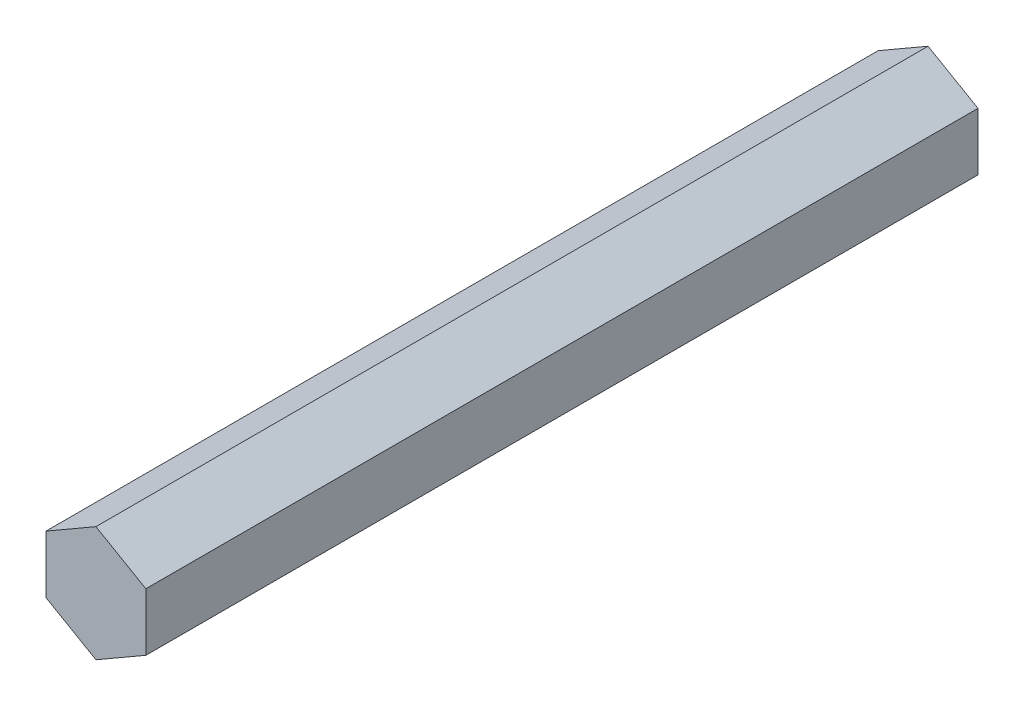
ISO-10303-21;
HEADER;
FILE_DESCRIPTION(('STEP AP214'),'2;1');
FILE_NAME('part.step','',(''),(''),'','','');
FILE_SCHEMA(('AUTOMOTIVE_DESIGN { 1 0 10303 214 1 1 1 1 }'));
ENDSEC;
DATA;
#1=APPLICATION_CONTEXT('core data for automotive mechanical design processes');
#2=APPLICATION_PROTOCOL_DEFINITION('international standard','automotive_design',2000,#1);
#3=PRODUCT_CONTEXT('',#1,'mechanical');
#4=PRODUCT('Part','Part','',(#3));
#5=PRODUCT_RELATED_PRODUCT_CATEGORY('part','',(#4));
#6=PRODUCT_DEFINITION_FORMATION('','',#4);
#7=PRODUCT_DEFINITION_CONTEXT('part definition',#1,'design');
#8=PRODUCT_DEFINITION('design','',#6,#7);
#9=PRODUCT_DEFINITION_SHAPE('','',#8);
#10=(LENGTH_UNIT() NAMED_UNIT(*) SI_UNIT(.MILLI.,.METRE.));
#11=(NAMED_UNIT(*) PLANE_ANGLE_UNIT() SI_UNIT($,.RADIAN.));
#12=(NAMED_UNIT(*) SI_UNIT($,.STERADIAN.) SOLID_ANGLE_UNIT());
#13=UNCERTAINTY_MEASURE_WITH_UNIT(LENGTH_MEASURE(1.E-05),#10,'distance_accuracy_value','');
#14=(GEOMETRIC_REPRESENTATION_CONTEXT(3) GLOBAL_UNCERTAINTY_ASSIGNED_CONTEXT((#13)) GLOBAL_UNIT_ASSIGNED_CONTEXT((#10,
#11,#12)) REPRESENTATION_CONTEXT('',''));
#15=CARTESIAN_POINT('',(0.,0.,0.));
#16=DIRECTION('',(0.,0.,1.));
#17=DIRECTION('',(1.,0.,0.));
#18=AXIS2_PLACEMENT_3D('',#15,#16,#17);
#19=CARTESIAN_POINT('',(4.76249999999997,2.74963065701565,79.375));
#20=DIRECTION('',(-0.499999999999995,-0.866025403784441,0.));
#21=DIRECTION('',(0.866025403784442,-0.499999999999995,0.));
#22=AXIS2_PLACEMENT_3D('',#19,#20,#21);
#23=PLANE('',#22);
#24=DIRECTION('',(-0.866025403784442,0.499999999999995,0.));
#25=VECTOR('',#24,1.);
#26=CARTESIAN_POINT('',(4.76249999999997,2.74963065701565,0.));
#27=LINE('',#26,#25);
#28=CARTESIAN_POINT('',(4.76249999999997,2.74963065701565,0.));
#29=VERTEX_POINT('',#28);
#30=CARTESIAN_POINT('',(0.,5.49926131403119,0.));
#31=VERTEX_POINT('',#30);
#32=EDGE_CURVE('E119',#29,#31,#27,.T.);
#33=ORIENTED_EDGE('',*,*,#32,.T.);
#34=DIRECTION('',(0.,0.,-1.));
#35=VECTOR('',#34,1.);
#36=CARTESIAN_POINT('',(0.,5.49926131403119,79.375));
#37=LINE('',#36,#35);
#38=CARTESIAN_POINT('',(0.,5.49926131403119,79.375));
#39=VERTEX_POINT('',#38);
#40=EDGE_CURVE('E11',#39,#31,#37,.T.);
#41=ORIENTED_EDGE('',*,*,#40,.F.);
#42=DIRECTION('',(-0.866025403784442,0.499999999999995,0.));
#43=VECTOR('',#42,1.);
#44=CARTESIAN_POINT('',(4.76249999999997,2.74963065701565,79.375));
#45=LINE('',#44,#43);
#46=CARTESIAN_POINT('',(4.76249999999997,2.74963065701565,79.375));
#47=VERTEX_POINT('',#46);
#48=EDGE_CURVE('E129',#47,#39,#45,.T.);
#49=ORIENTED_EDGE('',*,*,#48,.F.);
#50=DIRECTION('',(0.,0.,-1.));
#51=VECTOR('',#50,1.);
#52=CARTESIAN_POINT('',(4.76249999999997,2.74963065701565,79.375));
#53=LINE('',#52,#51);
#54=EDGE_CURVE('E115',#47,#29,#53,.T.);
#55=ORIENTED_EDGE('',*,*,#54,.T.);
#56=EDGE_LOOP('',(#33,#41,#49,#55));
#57=FACE_BOUND('',#56,.T.);
#58=ADVANCED_FACE('F35',(#57),#23,.F.);
#59=CARTESIAN_POINT('',(0.,5.49926131403119,79.375));
#60=DIRECTION('',(0.500000000000001,-0.866025403784438,0.));
#61=DIRECTION('',(0.866025403784438,0.500000000000001,0.));
#62=AXIS2_PLACEMENT_3D('',#59,#60,#61);
#63=PLANE('',#62);
#64=DIRECTION('',(-0.866025403784438,-0.500000000000001,0.));
#65=VECTOR('',#64,1.);
#66=CARTESIAN_POINT('',(0.,5.49926131403119,0.));
#67=LINE('',#66,#65);
#68=CARTESIAN_POINT('',(-4.76250000000001,2.74963065701558,0.));
#69=VERTEX_POINT('',#68);
#70=EDGE_CURVE('E122',#31,#69,#67,.T.);
#71=ORIENTED_EDGE('',*,*,#70,.T.);
#72=DIRECTION('',(0.,0.,-1.));
#73=VECTOR('',#72,1.);
#74=CARTESIAN_POINT('',(-4.76250000000001,2.74963065701558,79.375));
#75=LINE('',#74,#73);
#76=CARTESIAN_POINT('',(-4.76250000000001,2.74963065701558,79.375));
#77=VERTEX_POINT('',#76);
#78=EDGE_CURVE('E43',#77,#69,#75,.T.);
#79=ORIENTED_EDGE('',*,*,#78,.F.);
#80=DIRECTION('',(-0.866025403784438,-0.500000000000001,0.));
#81=VECTOR('',#80,1.);
#82=CARTESIAN_POINT('',(0.,5.49926131403119,79.375));
#83=LINE('',#82,#81);
#84=EDGE_CURVE('E88',#39,#77,#83,.T.);
#85=ORIENTED_EDGE('',*,*,#84,.F.);
#86=ORIENTED_EDGE('',*,*,#40,.T.);
#87=EDGE_LOOP('',(#71,#79,#85,#86));
#88=FACE_BOUND('',#87,.T.);
#89=ADVANCED_FACE('F153',(#88),#63,.F.);
#90=CARTESIAN_POINT('',(-4.76250000000001,2.74963065701558,79.375));
#91=DIRECTION('',(1.,0.,0.));
#92=DIRECTION('',(0.,1.,0.));
#93=AXIS2_PLACEMENT_3D('',#90,#91,#92);
#94=PLANE('',#93);
#95=DIRECTION('',(0.,-1.,0.));
#96=VECTOR('',#95,1.);
#97=CARTESIAN_POINT('',(-4.76250000000001,2.74963065701558,0.));
#98=LINE('',#97,#96);
#99=CARTESIAN_POINT('',(-4.76249999999999,-2.74963065701562,0.));
#100=VERTEX_POINT('',#99);
#101=EDGE_CURVE('E124',#69,#100,#98,.T.);
#102=ORIENTED_EDGE('',*,*,#101,.T.);
#103=DIRECTION('',(0.,0.,-1.));
#104=VECTOR('',#103,1.);
#105=CARTESIAN_POINT('',(-4.76249999999999,-2.74963065701562,79.375));
#106=LINE('',#105,#104);
#107=CARTESIAN_POINT('',(-4.76249999999999,-2.74963065701562,79.375));
#108=VERTEX_POINT('',#107);
#109=EDGE_CURVE('E110',#108,#100,#106,.T.);
#110=ORIENTED_EDGE('',*,*,#109,.F.);
#111=DIRECTION('',(0.,-1.,0.));
#112=VECTOR('',#111,1.);
#113=CARTESIAN_POINT('',(-4.76250000000001,2.74963065701558,79.375));
#114=LINE('',#113,#112);
#115=EDGE_CURVE('E101',#77,#108,#114,.T.);
#116=ORIENTED_EDGE('',*,*,#115,.F.);
#117=ORIENTED_EDGE('',*,*,#78,.T.);
#118=EDGE_LOOP('',(#102,#110,#116,#117));
#119=FACE_BOUND('',#118,.T.);
#120=ADVANCED_FACE('F135',(#119),#94,.F.);
#121=CARTESIAN_POINT('',(-4.76249999999999,-2.74963065701562,79.375));
#122=DIRECTION('',(0.499999999999995,0.866025403784441,0.));
#123=DIRECTION('',(-0.866025403784442,0.499999999999995,0.));
#124=AXIS2_PLACEMENT_3D('',#121,#122,#123);
#125=PLANE('',#124);
#126=DIRECTION('',(0.866025403784442,-0.499999999999995,0.));
#127=VECTOR('',#126,1.);
#128=CARTESIAN_POINT('',(-4.76249999999999,-2.74963065701562,0.));
#129=LINE('',#128,#127);
#130=CARTESIAN_POINT('',(0.,-5.49926131403119,0.));
#131=VERTEX_POINT('',#130);
#132=EDGE_CURVE('E109',#100,#131,#129,.T.);
#133=ORIENTED_EDGE('',*,*,#132,.T.);
#134=DIRECTION('',(0.,0.,-1.));
#135=VECTOR('',#134,1.);
#136=CARTESIAN_POINT('',(0.,-5.49926131403119,79.375));
#137=LINE('',#136,#135);
#138=CARTESIAN_POINT('',(0.,-5.49926131403119,79.375));
#139=VERTEX_POINT('',#138);
#140=EDGE_CURVE('E106',#139,#131,#137,.T.);
#141=ORIENTED_EDGE('',*,*,#140,.F.);
#142=DIRECTION('',(0.866025403784442,-0.499999999999995,0.));
#143=VECTOR('',#142,1.);
#144=CARTESIAN_POINT('',(-4.76249999999999,-2.74963065701562,79.375));
#145=LINE('',#144,#143);
#146=EDGE_CURVE('E95',#108,#139,#145,.T.);
#147=ORIENTED_EDGE('',*,*,#146,.F.);
#148=ORIENTED_EDGE('',*,*,#109,.T.);
#149=EDGE_LOOP('',(#133,#141,#147,#148));
#150=FACE_BOUND('',#149,.T.);
#151=ADVANCED_FACE('F107',(#150),#125,.F.);
#152=CARTESIAN_POINT('',(0.,-5.49926131403119,79.375));
#153=DIRECTION('',(-0.500000000000007,0.866025403784435,0.));
#154=DIRECTION('',(-0.866025403784435,-0.500000000000007,0.));
#155=AXIS2_PLACEMENT_3D('',#152,#153,#154);
#156=PLANE('',#155);
#157=DIRECTION('',(0.866025403784435,0.500000000000007,0.));
#158=VECTOR('',#157,1.);
#159=CARTESIAN_POINT('',(0.,-5.49926131403119,0.));
#160=LINE('',#159,#158);
#161=CARTESIAN_POINT('',(4.76250000000003,-2.74963065701555,0.));
#162=VERTEX_POINT('',#161);
#163=EDGE_CURVE('E74',#131,#162,#160,.T.);
#164=ORIENTED_EDGE('',*,*,#163,.T.);
#165=DIRECTION('',(0.,0.,-1.));
#166=VECTOR('',#165,1.);
#167=CARTESIAN_POINT('',(4.76250000000003,-2.74963065701555,79.375));
#168=LINE('',#167,#166);
#169=CARTESIAN_POINT('',(4.76250000000003,-2.74963065701555,79.375));
#170=VERTEX_POINT('',#169);
#171=EDGE_CURVE('E111',#170,#162,#168,.T.);
#172=ORIENTED_EDGE('',*,*,#171,.F.);
#173=DIRECTION('',(0.866025403784435,0.500000000000007,0.));
#174=VECTOR('',#173,1.);
#175=CARTESIAN_POINT('',(0.,-5.49926131403119,79.375));
#176=LINE('',#175,#174);
#177=EDGE_CURVE('E99',#139,#170,#176,.T.);
#178=ORIENTED_EDGE('',*,*,#177,.F.);
#179=ORIENTED_EDGE('',*,*,#140,.T.);
#180=EDGE_LOOP('',(#164,#172,#178,#179));
#181=FACE_BOUND('',#180,.T.);
#182=ADVANCED_FACE('F113',(#181),#156,.F.);
#183=CARTESIAN_POINT('',(4.76250000000003,-2.74963065701555,79.375));
#184=DIRECTION('',(-1.,0.,0.));
#185=DIRECTION('',(0.,-1.,0.));
#186=AXIS2_PLACEMENT_3D('',#183,#184,#185);
#187=PLANE('',#186);
#188=DIRECTION('',(0.,1.,0.));
#189=VECTOR('',#188,1.);
#190=CARTESIAN_POINT('',(4.76250000000003,-2.74963065701555,0.));
#191=LINE('',#190,#189);
#192=EDGE_CURVE('E80',#162,#29,#191,.T.);
#193=ORIENTED_EDGE('',*,*,#192,.T.);
#194=ORIENTED_EDGE('',*,*,#54,.F.);
#195=DIRECTION('',(0.,1.,0.));
#196=VECTOR('',#195,1.);
#197=CARTESIAN_POINT('',(4.76250000000003,-2.74963065701555,79.375));
#198=LINE('',#197,#196);
#199=EDGE_CURVE('E51',#170,#47,#198,.T.);
#200=ORIENTED_EDGE('',*,*,#199,.F.);
#201=ORIENTED_EDGE('',*,*,#171,.T.);
#202=EDGE_LOOP('',(#193,#194,#200,#201));
#203=FACE_BOUND('',#202,.T.);
#204=ADVANCED_FACE('F142',(#203),#187,.F.);
#205=CARTESIAN_POINT('',(0.,0.,79.375));
#206=DIRECTION('',(0.,0.,1.));
#207=DIRECTION('',(1.,0.,0.));
#208=AXIS2_PLACEMENT_3D('',#205,#206,#207);
#209=PLANE('',#208);
#210=ORIENTED_EDGE('',*,*,#48,.T.);
#211=ORIENTED_EDGE('',*,*,#84,.T.);
#212=ORIENTED_EDGE('',*,*,#115,.T.);
#213=ORIENTED_EDGE('',*,*,#146,.T.);
#214=ORIENTED_EDGE('',*,*,#177,.T.);
#215=ORIENTED_EDGE('',*,*,#199,.T.);
#216=EDGE_LOOP('',(#210,#211,#212,#213,#214,#215));
#217=FACE_BOUND('',#216,.T.);
#218=ADVANCED_FACE('F97',(#217),#209,.T.);
#219=CARTESIAN_POINT('',(0.,0.,0.));
#220=DIRECTION('',(0.,0.,1.));
#221=DIRECTION('',(1.,0.,0.));
#222=AXIS2_PLACEMENT_3D('',#219,#220,#221);
#223=PLANE('',#222);
#224=ORIENTED_EDGE('',*,*,#32,.F.);
#225=ORIENTED_EDGE('',*,*,#192,.F.);
#226=ORIENTED_EDGE('',*,*,#163,.F.);
#227=ORIENTED_EDGE('',*,*,#132,.F.);
#228=ORIENTED_EDGE('',*,*,#101,.F.);
#229=ORIENTED_EDGE('',*,*,#70,.F.);
#230=EDGE_LOOP('',(#224,#225,#226,#227,#228,#229));
#231=FACE_BOUND('',#230,.T.);
#232=ADVANCED_FACE('F138',(#231),#223,.F.);
#233=CLOSED_SHELL('',(#58,#89,#120,#151,#182,#204,#218,#232));
#234=MANIFOLD_SOLID_BREP('B2',#233);
#235=ADVANCED_BREP_SHAPE_REPRESENTATION('',(#18,#234),#14);
#236=SHAPE_DEFINITION_REPRESENTATION(#9,#235);
ENDSEC;
END-ISO-10303-21;
